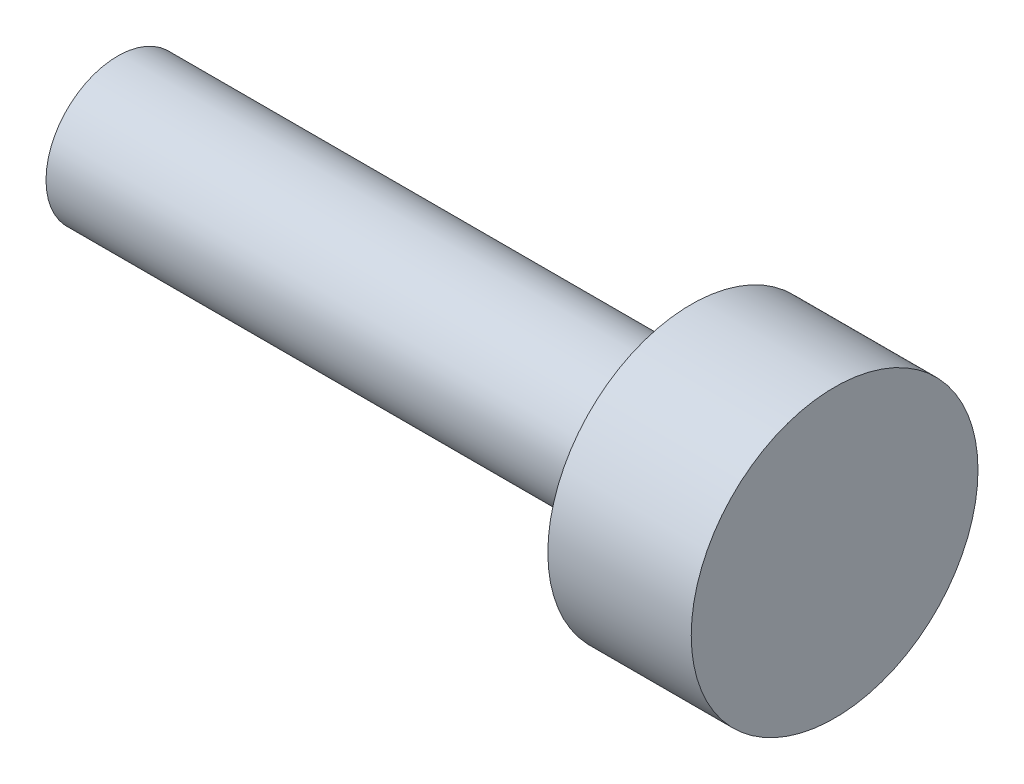
ISO-10303-21;
HEADER;
FILE_DESCRIPTION(('STEP AP214'),'2;1');
FILE_NAME('part.step','',(''),(''),'','','');
FILE_SCHEMA(('AUTOMOTIVE_DESIGN { 1 0 10303 214 1 1 1 1 }'));
ENDSEC;
DATA;
#1=APPLICATION_CONTEXT('core data for automotive mechanical design processes');
#2=APPLICATION_PROTOCOL_DEFINITION('international standard','automotive_design',2000,#1);
#3=PRODUCT_CONTEXT('',#1,'mechanical');
#4=PRODUCT('Part','Part','',(#3));
#5=PRODUCT_RELATED_PRODUCT_CATEGORY('part','',(#4));
#6=PRODUCT_DEFINITION_FORMATION('','',#4);
#7=PRODUCT_DEFINITION_CONTEXT('part definition',#1,'design');
#8=PRODUCT_DEFINITION('design','',#6,#7);
#9=PRODUCT_DEFINITION_SHAPE('','',#8);
#10=(LENGTH_UNIT() NAMED_UNIT(*) SI_UNIT(.MILLI.,.METRE.));
#11=(NAMED_UNIT(*) PLANE_ANGLE_UNIT() SI_UNIT($,.RADIAN.));
#12=(NAMED_UNIT(*) SI_UNIT($,.STERADIAN.) SOLID_ANGLE_UNIT());
#13=UNCERTAINTY_MEASURE_WITH_UNIT(LENGTH_MEASURE(1.E-05),#10,'distance_accuracy_value','');
#14=(GEOMETRIC_REPRESENTATION_CONTEXT(3) GLOBAL_UNCERTAINTY_ASSIGNED_CONTEXT((#13)) GLOBAL_UNIT_ASSIGNED_CONTEXT((#10,
#11,#12)) REPRESENTATION_CONTEXT('',''));
#15=CARTESIAN_POINT('',(0.,0.,0.));
#16=DIRECTION('',(0.,0.,1.));
#17=DIRECTION('',(1.,0.,0.));
#18=AXIS2_PLACEMENT_3D('',#15,#16,#17);
#19=CARTESIAN_POINT('',(-116.835752997229,26.1754045737225,0.));
#20=DIRECTION('',(-1.,0.,0.));
#21=DIRECTION('',(0.,0.,1.));
#22=AXIS2_PLACEMENT_3D('',#19,#20,#21);
#23=CYLINDRICAL_SURFACE('',#22,1.);
#24=CARTESIAN_POINT('',(-105.835752997229,26.1754045737225,0.));
#25=DIRECTION('',(-1.,0.,0.));
#26=DIRECTION('',(0.,0.,1.));
#27=AXIS2_PLACEMENT_3D('',#24,#25,#26);
#28=CIRCLE('',#27,1.);
#29=CARTESIAN_POINT('',(-105.835752997229,26.1754045737225,1.));
#30=VERTEX_POINT('',#29);
#31=EDGE_CURVE('E10',#30,#30,#28,.T.);
#32=ORIENTED_EDGE('',*,*,#31,.T.);
#33=EDGE_LOOP('',(#32));
#34=FACE_BOUND('',#33,.T.);
#35=CARTESIAN_POINT('',(-113.835752997229,26.1754045737225,0.));
#36=DIRECTION('',(-1.,0.,0.));
#37=DIRECTION('',(0.,0.,1.));
#38=AXIS2_PLACEMENT_3D('',#35,#36,#37);
#39=CIRCLE('',#38,1.);
#40=CARTESIAN_POINT('',(-113.835752997229,26.1754045737225,1.));
#41=VERTEX_POINT('',#40);
#42=EDGE_CURVE('E38',#41,#41,#39,.T.);
#43=ORIENTED_EDGE('',*,*,#42,.F.);
#44=EDGE_LOOP('',(#43));
#45=FACE_BOUND('',#44,.T.);
#46=ADVANCED_FACE('F35',(#34,#45),#23,.T.);
#47=CARTESIAN_POINT('',(-105.835752997229,27.1754045737225,0.));
#48=DIRECTION('',(1.,0.,0.));
#49=DIRECTION('',(0.,0.,-1.));
#50=AXIS2_PLACEMENT_3D('',#47,#48,#49);
#51=PLANE('',#50);
#52=ORIENTED_EDGE('',*,*,#31,.F.);
#53=EDGE_LOOP('',(#52));
#54=FACE_BOUND('',#53,.T.);
#55=CARTESIAN_POINT('',(-105.835752997229,26.1754045737225,0.));
#56=DIRECTION('',(-1.,0.,0.));
#57=DIRECTION('',(0.,0.,1.));
#58=AXIS2_PLACEMENT_3D('',#55,#56,#57);
#59=CIRCLE('',#58,2.);
#60=CARTESIAN_POINT('',(-105.835752997229,26.1754045737225,2.));
#61=VERTEX_POINT('',#60);
#62=EDGE_CURVE('E42',#61,#61,#59,.T.);
#63=ORIENTED_EDGE('',*,*,#62,.T.);
#64=EDGE_LOOP('',(#63));
#65=FACE_BOUND('',#64,.T.);
#66=ADVANCED_FACE('F58',(#54,#65),#51,.F.);
#67=CARTESIAN_POINT('',(-116.835752997229,26.1754045737225,0.));
#68=DIRECTION('',(-1.,0.,0.));
#69=DIRECTION('',(0.,0.,1.));
#70=AXIS2_PLACEMENT_3D('',#67,#68,#69);
#71=CYLINDRICAL_SURFACE('',#70,2.);
#72=ORIENTED_EDGE('',*,*,#62,.F.);
#73=EDGE_LOOP('',(#72));
#74=FACE_BOUND('',#73,.T.);
#75=CARTESIAN_POINT('',(-103.835752997229,26.1754045737225,0.));
#76=DIRECTION('',(-1.,0.,0.));
#77=DIRECTION('',(0.,0.,1.));
#78=AXIS2_PLACEMENT_3D('',#75,#76,#77);
#79=CIRCLE('',#78,2.);
#80=CARTESIAN_POINT('',(-103.835752997229,26.1754045737225,2.));
#81=VERTEX_POINT('',#80);
#82=EDGE_CURVE('E46',#81,#81,#79,.T.);
#83=ORIENTED_EDGE('',*,*,#82,.T.);
#84=EDGE_LOOP('',(#83));
#85=FACE_BOUND('',#84,.T.);
#86=ADVANCED_FACE('F62',(#74,#85),#71,.T.);
#87=CARTESIAN_POINT('',(-103.835752997229,28.1754045737225,0.));
#88=DIRECTION('',(-1.,0.,0.));
#89=DIRECTION('',(0.,0.,1.));
#90=AXIS2_PLACEMENT_3D('',#87,#88,#89);
#91=PLANE('',#90);
#92=ORIENTED_EDGE('',*,*,#82,.F.);
#93=EDGE_LOOP('',(#92));
#94=FACE_BOUND('',#93,.T.);
#95=ADVANCED_FACE('F67',(#94),#91,.F.);
#96=CARTESIAN_POINT('',(-113.835752997229,0.,0.));
#97=DIRECTION('',(-1.,0.,0.));
#98=DIRECTION('',(0.,0.,1.));
#99=AXIS2_PLACEMENT_3D('',#96,#97,#98);
#100=PLANE('',#99);
#101=ORIENTED_EDGE('',*,*,#42,.T.);
#102=EDGE_LOOP('',(#101));
#103=FACE_BOUND('',#102,.T.);
#104=ADVANCED_FACE('F55',(#103),#100,.T.);
#105=CLOSED_SHELL('',(#46,#66,#86,#95,#104));
#106=MANIFOLD_SOLID_BREP('B2',#105);
#107=ADVANCED_BREP_SHAPE_REPRESENTATION('',(#18,#106),#14);
#108=SHAPE_DEFINITION_REPRESENTATION(#9,#107);
ENDSEC;
END-ISO-10303-21;
